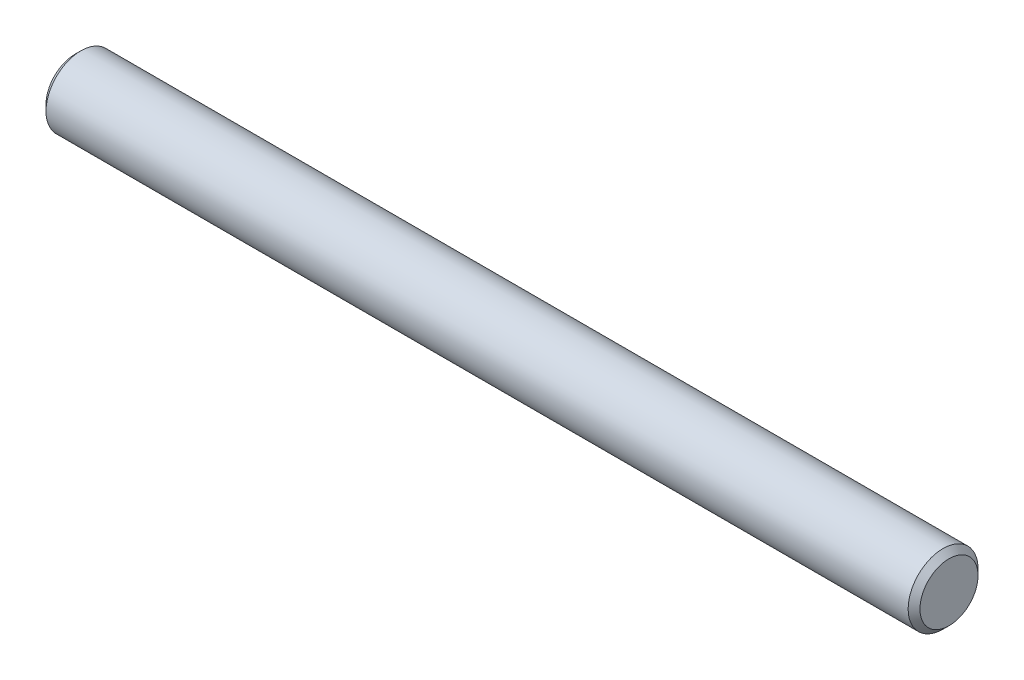
ISO-10303-21;
HEADER;
FILE_DESCRIPTION(('STEP AP214'),'2;1');
FILE_NAME('part.step','',(''),(''),'','','');
FILE_SCHEMA(('AUTOMOTIVE_DESIGN { 1 0 10303 214 1 1 1 1 }'));
ENDSEC;
DATA;
#1=APPLICATION_CONTEXT('core data for automotive mechanical design processes');
#2=APPLICATION_PROTOCOL_DEFINITION('international standard','automotive_design',2000,#1);
#3=PRODUCT_CONTEXT('',#1,'mechanical');
#4=PRODUCT('Part','Part','',(#3));
#5=PRODUCT_RELATED_PRODUCT_CATEGORY('part','',(#4));
#6=PRODUCT_DEFINITION_FORMATION('','',#4);
#7=PRODUCT_DEFINITION_CONTEXT('part definition',#1,'design');
#8=PRODUCT_DEFINITION('design','',#6,#7);
#9=PRODUCT_DEFINITION_SHAPE('','',#8);
#10=(LENGTH_UNIT() NAMED_UNIT(*) SI_UNIT(.MILLI.,.METRE.));
#11=(NAMED_UNIT(*) PLANE_ANGLE_UNIT() SI_UNIT($,.RADIAN.));
#12=(NAMED_UNIT(*) SI_UNIT($,.STERADIAN.) SOLID_ANGLE_UNIT());
#13=UNCERTAINTY_MEASURE_WITH_UNIT(LENGTH_MEASURE(1.E-05),#10,'distance_accuracy_value','');
#14=(GEOMETRIC_REPRESENTATION_CONTEXT(3) GLOBAL_UNCERTAINTY_ASSIGNED_CONTEXT((#13)) GLOBAL_UNIT_ASSIGNED_CONTEXT((#10,
#11,#12)) REPRESENTATION_CONTEXT('',''));
#15=CARTESIAN_POINT('',(0.,0.,0.));
#16=DIRECTION('',(0.,0.,1.));
#17=DIRECTION('',(1.,0.,0.));
#18=AXIS2_PLACEMENT_3D('',#15,#16,#17);
#19=CARTESIAN_POINT('',(-50.,0.,0.));
#20=DIRECTION('',(1.,0.,0.));
#21=DIRECTION('',(0.,0.,-1.));
#22=AXIS2_PLACEMENT_3D('',#19,#20,#21);
#23=PLANE('',#22);
#24=CARTESIAN_POINT('',(-50.,0.,0.));
#25=DIRECTION('',(-1.,0.,0.));
#26=DIRECTION('',(0.,0.,1.));
#27=AXIS2_PLACEMENT_3D('',#24,#25,#26);
#28=CIRCLE('',#27,3.3235);
#29=CARTESIAN_POINT('',(-50.,0.,3.3235));
#30=VERTEX_POINT('',#29);
#31=EDGE_CURVE('E10',#30,#30,#28,.T.);
#32=ORIENTED_EDGE('',*,*,#31,.T.);
#33=EDGE_LOOP('',(#32));
#34=FACE_BOUND('',#33,.T.);
#35=ADVANCED_FACE('F34',(#34),#23,.F.);
#36=CARTESIAN_POINT('',(-49.3235,0.,0.));
#37=DIRECTION('',(1.,0.,0.));
#38=DIRECTION('',(0.,0.,-1.));
#39=AXIS2_PLACEMENT_3D('',#36,#37,#38);
#40=CONICAL_SURFACE('',#39,4.,0.785398163397451);
#41=ORIENTED_EDGE('',*,*,#31,.F.);
#42=EDGE_LOOP('',(#41));
#43=FACE_BOUND('',#42,.T.);
#44=CARTESIAN_POINT('',(-49.3235,0.,0.));
#45=DIRECTION('',(-1.,0.,0.));
#46=DIRECTION('',(0.,0.,1.));
#47=AXIS2_PLACEMENT_3D('',#44,#45,#46);
#48=CIRCLE('',#47,4.);
#49=CARTESIAN_POINT('',(-49.3235,0.,4.));
#50=VERTEX_POINT('',#49);
#51=EDGE_CURVE('E40',#50,#50,#48,.T.);
#52=ORIENTED_EDGE('',*,*,#51,.T.);
#53=EDGE_LOOP('',(#52));
#54=FACE_BOUND('',#53,.T.);
#55=ADVANCED_FACE('F66',(#43,#54),#40,.T.);
#56=CARTESIAN_POINT('',(50.,0.,0.));
#57=DIRECTION('',(-1.,0.,0.));
#58=DIRECTION('',(0.,0.,1.));
#59=AXIS2_PLACEMENT_3D('',#56,#57,#58);
#60=CYLINDRICAL_SURFACE('',#59,4.);
#61=ORIENTED_EDGE('',*,*,#51,.F.);
#62=EDGE_LOOP('',(#61));
#63=FACE_BOUND('',#62,.T.);
#64=CARTESIAN_POINT('',(49.3235,0.,0.));
#65=DIRECTION('',(-1.,0.,0.));
#66=DIRECTION('',(0.,0.,1.));
#67=AXIS2_PLACEMENT_3D('',#64,#65,#66);
#68=CIRCLE('',#67,4.);
#69=CARTESIAN_POINT('',(49.3235,0.,4.));
#70=VERTEX_POINT('',#69);
#71=EDGE_CURVE('E44',#70,#70,#68,.T.);
#72=ORIENTED_EDGE('',*,*,#71,.T.);
#73=EDGE_LOOP('',(#72));
#74=FACE_BOUND('',#73,.T.);
#75=ADVANCED_FACE('F62',(#63,#74),#60,.T.);
#76=CARTESIAN_POINT('',(50.,0.,0.));
#77=DIRECTION('',(-1.,0.,0.));
#78=DIRECTION('',(0.,0.,1.));
#79=AXIS2_PLACEMENT_3D('',#76,#77,#78);
#80=CONICAL_SURFACE('',#79,3.3235,0.785398163397451);
#81=ORIENTED_EDGE('',*,*,#71,.F.);
#82=EDGE_LOOP('',(#81));
#83=FACE_BOUND('',#82,.T.);
#84=CARTESIAN_POINT('',(50.,0.,0.));
#85=DIRECTION('',(-1.,0.,0.));
#86=DIRECTION('',(0.,0.,1.));
#87=AXIS2_PLACEMENT_3D('',#84,#85,#86);
#88=CIRCLE('',#87,3.3235);
#89=CARTESIAN_POINT('',(50.,0.,3.3235));
#90=VERTEX_POINT('',#89);
#91=EDGE_CURVE('E48',#90,#90,#88,.T.);
#92=ORIENTED_EDGE('',*,*,#91,.T.);
#93=EDGE_LOOP('',(#92));
#94=FACE_BOUND('',#93,.T.);
#95=ADVANCED_FACE('F54',(#83,#94),#80,.T.);
#96=CARTESIAN_POINT('',(50.,3.3235,0.));
#97=DIRECTION('',(-1.,0.,0.));
#98=DIRECTION('',(0.,0.,1.));
#99=AXIS2_PLACEMENT_3D('',#96,#97,#98);
#100=PLANE('',#99);
#101=ORIENTED_EDGE('',*,*,#91,.F.);
#102=EDGE_LOOP('',(#101));
#103=FACE_BOUND('',#102,.T.);
#104=ADVANCED_FACE('F56',(#103),#100,.F.);
#105=CLOSED_SHELL('',(#35,#55,#75,#95,#104));
#106=MANIFOLD_SOLID_BREP('B2',#105);
#107=ADVANCED_BREP_SHAPE_REPRESENTATION('',(#18,#106),#14);
#108=SHAPE_DEFINITION_REPRESENTATION(#9,#107);
ENDSEC;
END-ISO-10303-21;
